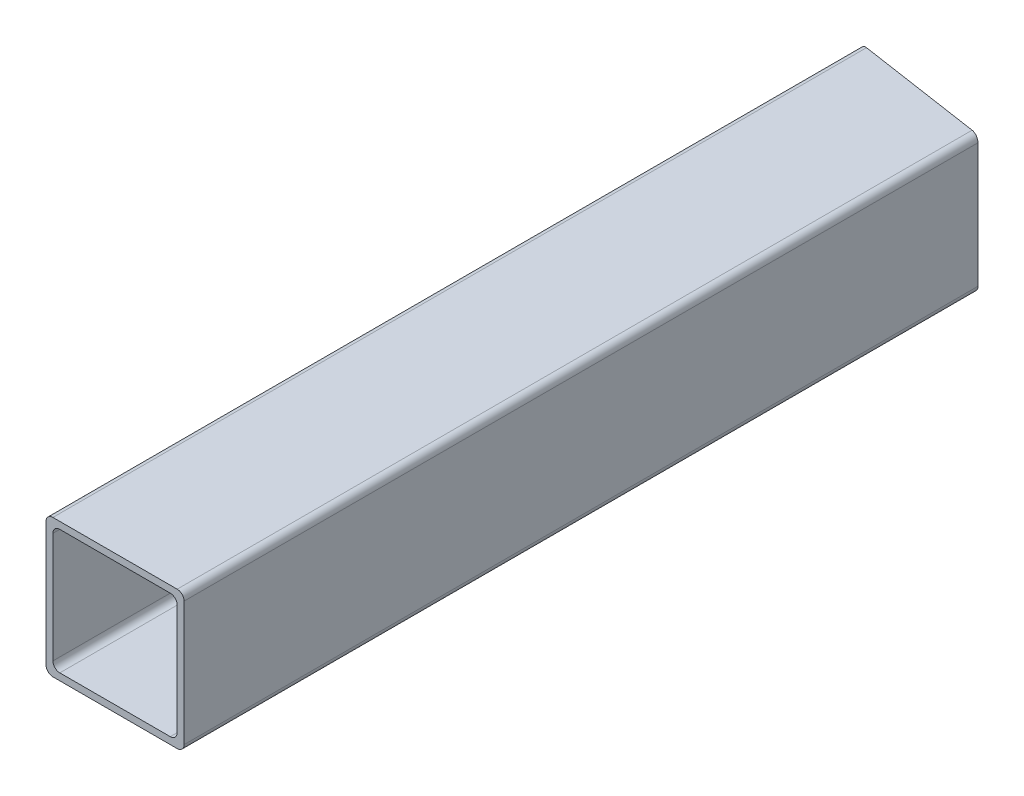
ISO-10303-21;
HEADER;
FILE_DESCRIPTION(('STEP AP214'),'2;1');
FILE_NAME('part.step','',(''),(''),'','','');
FILE_SCHEMA(('AUTOMOTIVE_DESIGN { 1 0 10303 214 1 1 1 1 }'));
ENDSEC;
DATA;
#1=APPLICATION_CONTEXT('core data for automotive mechanical design processes');
#2=APPLICATION_PROTOCOL_DEFINITION('international standard','automotive_design',2000,#1);
#3=PRODUCT_CONTEXT('',#1,'mechanical');
#4=PRODUCT('Part','Part','',(#3));
#5=PRODUCT_RELATED_PRODUCT_CATEGORY('part','',(#4));
#6=PRODUCT_DEFINITION_FORMATION('','',#4);
#7=PRODUCT_DEFINITION_CONTEXT('part definition',#1,'design');
#8=PRODUCT_DEFINITION('design','',#6,#7);
#9=PRODUCT_DEFINITION_SHAPE('','',#8);
#10=(LENGTH_UNIT() NAMED_UNIT(*) SI_UNIT(.MILLI.,.METRE.));
#11=(NAMED_UNIT(*) PLANE_ANGLE_UNIT() SI_UNIT($,.RADIAN.));
#12=(NAMED_UNIT(*) SI_UNIT($,.STERADIAN.) SOLID_ANGLE_UNIT());
#13=UNCERTAINTY_MEASURE_WITH_UNIT(LENGTH_MEASURE(1.E-05),#10,'distance_accuracy_value','');
#14=(GEOMETRIC_REPRESENTATION_CONTEXT(3) GLOBAL_UNCERTAINTY_ASSIGNED_CONTEXT((#13)) GLOBAL_UNIT_ASSIGNED_CONTEXT((#10,
#11,#12)) REPRESENTATION_CONTEXT('',''));
#15=CARTESIAN_POINT('',(0.,0.,0.));
#16=DIRECTION('',(0.,0.,1.));
#17=DIRECTION('',(1.,0.,0.));
#18=AXIS2_PLACEMENT_3D('',#15,#16,#17);
#19=CARTESIAN_POINT('',(18.,18.,236.));
#20=DIRECTION('',(0.,0.,-1.));
#21=DIRECTION('',(-1.,0.,0.));
#22=AXIS2_PLACEMENT_3D('',#19,#20,#21);
#23=PLANE('',#22);
#24=CARTESIAN_POINT('',(18.,18.,236.));
#25=DIRECTION('',(0.,0.,1.));
#26=DIRECTION('',(-1.,0.,0.));
#27=AXIS2_PLACEMENT_3D('',#24,#25,#26);
#28=CIRCLE('',#27,2.);
#29=CARTESIAN_POINT('',(20.,18.,236.));
#30=VERTEX_POINT('',#29);
#31=CARTESIAN_POINT('',(18.,20.,236.));
#32=VERTEX_POINT('',#31);
#33=EDGE_CURVE('E189',#30,#32,#28,.T.);
#34=ORIENTED_EDGE('',*,*,#33,.T.);
#35=DIRECTION('',(-1.,0.,0.));
#36=VECTOR('',#35,1.);
#37=CARTESIAN_POINT('',(-18.,20.,236.));
#38=LINE('',#37,#36);
#39=CARTESIAN_POINT('',(-18.,20.,236.));
#40=VERTEX_POINT('',#39);
#41=EDGE_CURVE('E201',#32,#40,#38,.T.);
#42=ORIENTED_EDGE('',*,*,#41,.T.);
#43=CARTESIAN_POINT('',(-18.,18.,236.));
#44=DIRECTION('',(0.,0.,1.));
#45=DIRECTION('',(1.,0.,0.));
#46=AXIS2_PLACEMENT_3D('',#43,#44,#45);
#47=CIRCLE('',#46,2.);
#48=CARTESIAN_POINT('',(-20.,18.,236.));
#49=VERTEX_POINT('',#48);
#50=EDGE_CURVE('E167',#40,#49,#47,.T.);
#51=ORIENTED_EDGE('',*,*,#50,.T.);
#52=DIRECTION('',(0.,-1.,0.));
#53=VECTOR('',#52,1.);
#54=CARTESIAN_POINT('',(-20.,18.,236.));
#55=LINE('',#54,#53);
#56=CARTESIAN_POINT('',(-20.,-18.,236.));
#57=VERTEX_POINT('',#56);
#58=EDGE_CURVE('E198',#49,#57,#55,.T.);
#59=ORIENTED_EDGE('',*,*,#58,.T.);
#60=CARTESIAN_POINT('',(-18.,-18.,236.));
#61=DIRECTION('',(0.,0.,1.));
#62=DIRECTION('',(1.,0.,0.));
#63=AXIS2_PLACEMENT_3D('',#60,#61,#62);
#64=CIRCLE('',#63,2.);
#65=CARTESIAN_POINT('',(-18.,-20.,236.));
#66=VERTEX_POINT('',#65);
#67=EDGE_CURVE('E196',#57,#66,#64,.T.);
#68=ORIENTED_EDGE('',*,*,#67,.T.);
#69=DIRECTION('',(1.,0.,0.));
#70=VECTOR('',#69,1.);
#71=CARTESIAN_POINT('',(-18.,-20.,236.));
#72=LINE('',#71,#70);
#73=CARTESIAN_POINT('',(18.,-20.,236.));
#74=VERTEX_POINT('',#73);
#75=EDGE_CURVE('E194',#66,#74,#72,.T.);
#76=ORIENTED_EDGE('',*,*,#75,.T.);
#77=CARTESIAN_POINT('',(18.,-18.,236.));
#78=DIRECTION('',(0.,0.,1.));
#79=DIRECTION('',(1.,0.,0.));
#80=AXIS2_PLACEMENT_3D('',#77,#78,#79);
#81=CIRCLE('',#80,2.);
#82=CARTESIAN_POINT('',(20.,-18.,236.));
#83=VERTEX_POINT('',#82);
#84=EDGE_CURVE('E192',#74,#83,#81,.T.);
#85=ORIENTED_EDGE('',*,*,#84,.T.);
#86=DIRECTION('',(0.,1.,0.));
#87=VECTOR('',#86,1.);
#88=CARTESIAN_POINT('',(20.,18.,236.));
#89=LINE('',#88,#87);
#90=EDGE_CURVE('E187',#83,#30,#89,.T.);
#91=ORIENTED_EDGE('',*,*,#90,.T.);
#92=EDGE_LOOP('',(#34,#42,#51,#59,#68,#76,#85,#91));
#93=FACE_BOUND('',#92,.T.);
#94=CARTESIAN_POINT('',(16.,16.,236.));
#95=DIRECTION('',(0.,0.,1.));
#96=DIRECTION('',(-1.,0.,0.));
#97=AXIS2_PLACEMENT_3D('',#94,#95,#96);
#98=CIRCLE('',#97,2.);
#99=CARTESIAN_POINT('',(18.,16.,236.));
#100=VERTEX_POINT('',#99);
#101=CARTESIAN_POINT('',(16.,18.,236.));
#102=VERTEX_POINT('',#101);
#103=EDGE_CURVE('E243',#100,#102,#98,.T.);
#104=ORIENTED_EDGE('',*,*,#103,.F.);
#105=DIRECTION('',(0.,1.,0.));
#106=VECTOR('',#105,1.);
#107=CARTESIAN_POINT('',(18.,16.,236.));
#108=LINE('',#107,#106);
#109=CARTESIAN_POINT('',(18.,-16.,236.));
#110=VERTEX_POINT('',#109);
#111=EDGE_CURVE('E228',#110,#100,#108,.T.);
#112=ORIENTED_EDGE('',*,*,#111,.F.);
#113=CARTESIAN_POINT('',(16.,-16.,236.));
#114=DIRECTION('',(0.,0.,1.));
#115=DIRECTION('',(1.,0.,0.));
#116=AXIS2_PLACEMENT_3D('',#113,#114,#115);
#117=CIRCLE('',#116,2.);
#118=CARTESIAN_POINT('',(16.,-18.,236.));
#119=VERTEX_POINT('',#118);
#120=EDGE_CURVE('E230',#119,#110,#117,.T.);
#121=ORIENTED_EDGE('',*,*,#120,.F.);
#122=DIRECTION('',(1.,0.,0.));
#123=VECTOR('',#122,1.);
#124=CARTESIAN_POINT('',(-16.,-18.,236.));
#125=LINE('',#124,#123);
#126=CARTESIAN_POINT('',(-16.,-18.,236.));
#127=VERTEX_POINT('',#126);
#128=EDGE_CURVE('E233',#127,#119,#125,.T.);
#129=ORIENTED_EDGE('',*,*,#128,.F.);
#130=CARTESIAN_POINT('',(-16.,-16.,236.));
#131=DIRECTION('',(0.,0.,1.));
#132=DIRECTION('',(1.,0.,0.));
#133=AXIS2_PLACEMENT_3D('',#130,#131,#132);
#134=CIRCLE('',#133,2.);
#135=CARTESIAN_POINT('',(-18.,-16.,236.));
#136=VERTEX_POINT('',#135);
#137=EDGE_CURVE('E235',#136,#127,#134,.T.);
#138=ORIENTED_EDGE('',*,*,#137,.F.);
#139=DIRECTION('',(0.,-1.,0.));
#140=VECTOR('',#139,1.);
#141=CARTESIAN_POINT('',(-18.,16.,236.));
#142=LINE('',#141,#140);
#143=CARTESIAN_POINT('',(-18.,16.,236.));
#144=VERTEX_POINT('',#143);
#145=EDGE_CURVE('E237',#144,#136,#142,.T.);
#146=ORIENTED_EDGE('',*,*,#145,.F.);
#147=CARTESIAN_POINT('',(-16.,16.,236.));
#148=DIRECTION('',(0.,0.,1.));
#149=DIRECTION('',(1.,0.,0.));
#150=AXIS2_PLACEMENT_3D('',#147,#148,#149);
#151=CIRCLE('',#150,2.);
#152=CARTESIAN_POINT('',(-16.,18.,236.));
#153=VERTEX_POINT('',#152);
#154=EDGE_CURVE('E239',#153,#144,#151,.T.);
#155=ORIENTED_EDGE('',*,*,#154,.F.);
#156=DIRECTION('',(-1.,0.,0.));
#157=VECTOR('',#156,1.);
#158=CARTESIAN_POINT('',(-16.,18.,236.));
#159=LINE('',#158,#157);
#160=EDGE_CURVE('E241',#102,#153,#159,.T.);
#161=ORIENTED_EDGE('',*,*,#160,.F.);
#162=EDGE_LOOP('',(#104,#112,#121,#129,#138,#146,#155,#161));
#163=FACE_BOUND('',#162,.T.);
#164=ADVANCED_FACE('F35',(#93,#163),#23,.F.);
#165=CARTESIAN_POINT('',(18.,18.,236.));
#166=DIRECTION('',(0.,0.,-1.));
#167=DIRECTION('',(-1.,0.,0.));
#168=AXIS2_PLACEMENT_3D('',#165,#166,#167);
#169=CYLINDRICAL_SURFACE('',#168,2.);
#170=DIRECTION('',(0.,0.,-1.));
#171=VECTOR('',#170,1.);
#172=CARTESIAN_POINT('',(20.,18.,236.));
#173=LINE('',#172,#171);
#174=CARTESIAN_POINT('',(20.,18.,6.00000000000001));
#175=VERTEX_POINT('',#174);
#176=EDGE_CURVE('E184',#30,#175,#173,.T.);
#177=ORIENTED_EDGE('',*,*,#176,.T.);
#178=CARTESIAN_POINT('',(18.,18.,5.70000000000001));
#179=DIRECTION('',(-0.148340452930245,0.,0.988936352868298));
#180=DIRECTION('',(-0.988936352868298,0.,-0.148340452930245));
#181=AXIS2_PLACEMENT_3D('',#178,#179,#180);
#182=ELLIPSE('',#181,2.02237484161567,2.);
#183=CARTESIAN_POINT('',(18.,20.,5.7));
#184=VERTEX_POINT('',#183);
#185=EDGE_CURVE('E50',#175,#184,#182,.T.);
#186=ORIENTED_EDGE('',*,*,#185,.T.);
#187=DIRECTION('',(0.,0.,-1.));
#188=VECTOR('',#187,1.);
#189=CARTESIAN_POINT('',(18.,20.,236.));
#190=LINE('',#189,#188);
#191=EDGE_CURVE('E43',#32,#184,#190,.T.);
#192=ORIENTED_EDGE('',*,*,#191,.F.);
#193=ORIENTED_EDGE('',*,*,#33,.F.);
#194=EDGE_LOOP('',(#177,#186,#192,#193));
#195=FACE_BOUND('',#194,.T.);
#196=ADVANCED_FACE('F37',(#195),#169,.T.);
#197=CARTESIAN_POINT('',(-18.,20.,236.));
#198=DIRECTION('',(0.,-1.,0.));
#199=DIRECTION('',(0.,0.,-1.));
#200=AXIS2_PLACEMENT_3D('',#197,#198,#199);
#201=PLANE('',#200);
#202=ORIENTED_EDGE('',*,*,#191,.T.);
#203=DIRECTION('',(0.988936352868298,0.,0.148340452930245));
#204=VECTOR('',#203,1.);
#205=CARTESIAN_POINT('',(20.,20.,6.));
#206=LINE('',#205,#204);
#207=CARTESIAN_POINT('',(-18.,20.,0.299999999999998));
#208=VERTEX_POINT('',#207);
#209=EDGE_CURVE('E148',#208,#184,#206,.T.);
#210=ORIENTED_EDGE('',*,*,#209,.F.);
#211=DIRECTION('',(0.,0.,-1.));
#212=VECTOR('',#211,1.);
#213=CARTESIAN_POINT('',(-18.,20.,236.));
#214=LINE('',#213,#212);
#215=EDGE_CURVE('E161',#40,#208,#214,.T.);
#216=ORIENTED_EDGE('',*,*,#215,.F.);
#217=ORIENTED_EDGE('',*,*,#41,.F.);
#218=EDGE_LOOP('',(#202,#210,#216,#217));
#219=FACE_BOUND('',#218,.T.);
#220=ADVANCED_FACE('F160',(#219),#201,.F.);
#221=CARTESIAN_POINT('',(-18.,18.,236.));
#222=DIRECTION('',(0.,0.,-1.));
#223=DIRECTION('',(-1.,0.,0.));
#224=AXIS2_PLACEMENT_3D('',#221,#222,#223);
#225=CYLINDRICAL_SURFACE('',#224,2.);
#226=ORIENTED_EDGE('',*,*,#215,.T.);
#227=CARTESIAN_POINT('',(-18.,18.,0.299999999999995));
#228=DIRECTION('',(-0.148340452930245,0.,0.988936352868298));
#229=DIRECTION('',(-0.988936352868298,0.,-0.148340452930245));
#230=AXIS2_PLACEMENT_3D('',#227,#228,#229);
#231=ELLIPSE('',#230,2.02237484161567,2.);
#232=CARTESIAN_POINT('',(-20.,18.,0.));
#233=VERTEX_POINT('',#232);
#234=EDGE_CURVE('E145',#208,#233,#231,.T.);
#235=ORIENTED_EDGE('',*,*,#234,.T.);
#236=DIRECTION('',(0.,0.,-1.));
#237=VECTOR('',#236,1.);
#238=CARTESIAN_POINT('',(-20.,18.,236.));
#239=LINE('',#238,#237);
#240=EDGE_CURVE('E168',#49,#233,#239,.T.);
#241=ORIENTED_EDGE('',*,*,#240,.F.);
#242=ORIENTED_EDGE('',*,*,#50,.F.);
#243=EDGE_LOOP('',(#226,#235,#241,#242));
#244=FACE_BOUND('',#243,.T.);
#245=ADVANCED_FACE('F166',(#244),#225,.T.);
#246=CARTESIAN_POINT('',(-20.,18.,236.));
#247=DIRECTION('',(1.,0.,0.));
#248=DIRECTION('',(0.,0.,-1.));
#249=AXIS2_PLACEMENT_3D('',#246,#247,#248);
#250=PLANE('',#249);
#251=DIRECTION('',(0.,-1.,0.));
#252=VECTOR('',#251,1.);
#253=CARTESIAN_POINT('',(-20.,18.,0.));
#254=LINE('',#253,#252);
#255=CARTESIAN_POINT('',(-20.,-18.,0.));
#256=VERTEX_POINT('',#255);
#257=EDGE_CURVE('E150',#233,#256,#254,.T.);
#258=ORIENTED_EDGE('',*,*,#257,.T.);
#259=DIRECTION('',(0.,0.,-1.));
#260=VECTOR('',#259,1.);
#261=CARTESIAN_POINT('',(-20.,-18.,236.));
#262=LINE('',#261,#260);
#263=EDGE_CURVE('E170',#57,#256,#262,.T.);
#264=ORIENTED_EDGE('',*,*,#263,.F.);
#265=ORIENTED_EDGE('',*,*,#58,.F.);
#266=ORIENTED_EDGE('',*,*,#240,.T.);
#267=EDGE_LOOP('',(#258,#264,#265,#266));
#268=FACE_BOUND('',#267,.T.);
#269=ADVANCED_FACE('F286',(#268),#250,.F.);
#270=CARTESIAN_POINT('',(-18.,-18.,236.));
#271=DIRECTION('',(0.,0.,-1.));
#272=DIRECTION('',(-1.,0.,0.));
#273=AXIS2_PLACEMENT_3D('',#270,#271,#272);
#274=CYLINDRICAL_SURFACE('',#273,2.);
#275=ORIENTED_EDGE('',*,*,#263,.T.);
#276=CARTESIAN_POINT('',(-18.,-18.,0.299999999999995));
#277=DIRECTION('',(-0.148340452930245,0.,0.988936352868298));
#278=DIRECTION('',(-0.988936352868298,0.,-0.148340452930245));
#279=AXIS2_PLACEMENT_3D('',#276,#277,#278);
#280=ELLIPSE('',#279,2.02237484161567,2.);
#281=CARTESIAN_POINT('',(-18.,-20.,0.300000000000003));
#282=VERTEX_POINT('',#281);
#283=EDGE_CURVE('E155',#256,#282,#280,.T.);
#284=ORIENTED_EDGE('',*,*,#283,.T.);
#285=DIRECTION('',(0.,0.,-1.));
#286=VECTOR('',#285,1.);
#287=CARTESIAN_POINT('',(-18.,-20.,236.));
#288=LINE('',#287,#286);
#289=EDGE_CURVE('E175',#66,#282,#288,.T.);
#290=ORIENTED_EDGE('',*,*,#289,.F.);
#291=ORIENTED_EDGE('',*,*,#67,.F.);
#292=EDGE_LOOP('',(#275,#284,#290,#291));
#293=FACE_BOUND('',#292,.T.);
#294=ADVANCED_FACE('F284',(#293),#274,.T.);
#295=CARTESIAN_POINT('',(-18.,-20.,236.));
#296=DIRECTION('',(0.,1.,0.));
#297=DIRECTION('',(0.,0.,1.));
#298=AXIS2_PLACEMENT_3D('',#295,#296,#297);
#299=PLANE('',#298);
#300=ORIENTED_EDGE('',*,*,#289,.T.);
#301=DIRECTION('',(0.988936352868298,0.,0.148340452930245));
#302=VECTOR('',#301,1.);
#303=CARTESIAN_POINT('',(20.,-20.,6.));
#304=LINE('',#303,#302);
#305=CARTESIAN_POINT('',(18.,-20.,5.70000000000001));
#306=VERTEX_POINT('',#305);
#307=EDGE_CURVE('E164',#282,#306,#304,.T.);
#308=ORIENTED_EDGE('',*,*,#307,.T.);
#309=DIRECTION('',(0.,0.,-1.));
#310=VECTOR('',#309,1.);
#311=CARTESIAN_POINT('',(18.,-20.,236.));
#312=LINE('',#311,#310);
#313=EDGE_CURVE('E178',#74,#306,#312,.T.);
#314=ORIENTED_EDGE('',*,*,#313,.F.);
#315=ORIENTED_EDGE('',*,*,#75,.F.);
#316=EDGE_LOOP('',(#300,#308,#314,#315));
#317=FACE_BOUND('',#316,.T.);
#318=ADVANCED_FACE('F269',(#317),#299,.F.);
#319=CARTESIAN_POINT('',(18.,-18.,236.));
#320=DIRECTION('',(0.,0.,-1.));
#321=DIRECTION('',(-1.,0.,0.));
#322=AXIS2_PLACEMENT_3D('',#319,#320,#321);
#323=CYLINDRICAL_SURFACE('',#322,2.);
#324=ORIENTED_EDGE('',*,*,#313,.T.);
#325=CARTESIAN_POINT('',(18.,-18.,5.70000000000001));
#326=DIRECTION('',(-0.148340452930245,0.,0.988936352868298));
#327=DIRECTION('',(-0.988936352868298,0.,-0.148340452930245));
#328=AXIS2_PLACEMENT_3D('',#325,#326,#327);
#329=ELLIPSE('',#328,2.02237484161567,2.);
#330=CARTESIAN_POINT('',(20.,-18.,6.));
#331=VERTEX_POINT('',#330);
#332=EDGE_CURVE('E248',#306,#331,#329,.T.);
#333=ORIENTED_EDGE('',*,*,#332,.T.);
#334=DIRECTION('',(0.,0.,-1.));
#335=VECTOR('',#334,1.);
#336=CARTESIAN_POINT('',(20.,-18.,236.));
#337=LINE('',#336,#335);
#338=EDGE_CURVE('E181',#83,#331,#337,.T.);
#339=ORIENTED_EDGE('',*,*,#338,.F.);
#340=ORIENTED_EDGE('',*,*,#84,.F.);
#341=EDGE_LOOP('',(#324,#333,#339,#340));
#342=FACE_BOUND('',#341,.T.);
#343=ADVANCED_FACE('F274',(#342),#323,.T.);
#344=CARTESIAN_POINT('',(20.,18.,236.));
#345=DIRECTION('',(-1.,0.,0.));
#346=DIRECTION('',(0.,-1.,0.));
#347=AXIS2_PLACEMENT_3D('',#344,#345,#346);
#348=PLANE('',#347);
#349=ORIENTED_EDGE('',*,*,#338,.T.);
#350=DIRECTION('',(0.,1.,0.));
#351=VECTOR('',#350,1.);
#352=CARTESIAN_POINT('',(20.,-20.,6.));
#353=LINE('',#352,#351);
#354=EDGE_CURVE('E264',#331,#175,#353,.T.);
#355=ORIENTED_EDGE('',*,*,#354,.T.);
#356=ORIENTED_EDGE('',*,*,#176,.F.);
#357=ORIENTED_EDGE('',*,*,#90,.F.);
#358=EDGE_LOOP('',(#349,#355,#356,#357));
#359=FACE_BOUND('',#358,.T.);
#360=ADVANCED_FACE('F305',(#359),#348,.F.);
#361=CARTESIAN_POINT('',(16.,16.,236.));
#362=DIRECTION('',(0.,0.,-1.));
#363=DIRECTION('',(-1.,0.,0.));
#364=AXIS2_PLACEMENT_3D('',#361,#362,#363);
#365=CYLINDRICAL_SURFACE('',#364,2.);
#366=CARTESIAN_POINT('',(16.,16.,5.39999999999999));
#367=DIRECTION('',(-0.148340452930245,0.,0.988936352868298));
#368=DIRECTION('',(-0.988936352868298,0.,-0.148340452930245));
#369=AXIS2_PLACEMENT_3D('',#366,#367,#368);
#370=ELLIPSE('',#369,2.02237484161567,2.);
#371=CARTESIAN_POINT('',(18.,16.,5.70000000000001));
#372=VERTEX_POINT('',#371);
#373=CARTESIAN_POINT('',(16.,18.,5.40000000000001));
#374=VERTEX_POINT('',#373);
#375=EDGE_CURVE('E251',#372,#374,#370,.T.);
#376=ORIENTED_EDGE('',*,*,#375,.F.);
#377=DIRECTION('',(0.,0.,-1.));
#378=VECTOR('',#377,1.);
#379=CARTESIAN_POINT('',(18.,16.,236.));
#380=LINE('',#379,#378);
#381=EDGE_CURVE('E225',#100,#372,#380,.T.);
#382=ORIENTED_EDGE('',*,*,#381,.F.);
#383=ORIENTED_EDGE('',*,*,#103,.T.);
#384=DIRECTION('',(0.,0.,-1.));
#385=VECTOR('',#384,1.);
#386=CARTESIAN_POINT('',(16.,18.,236.));
#387=LINE('',#386,#385);
#388=EDGE_CURVE('E190',#102,#374,#387,.T.);
#389=ORIENTED_EDGE('',*,*,#388,.T.);
#390=EDGE_LOOP('',(#376,#382,#383,#389));
#391=FACE_BOUND('',#390,.T.);
#392=ADVANCED_FACE('F303',(#391),#365,.F.);
#393=CARTESIAN_POINT('',(-16.,18.,236.));
#394=DIRECTION('',(0.,-1.,0.));
#395=DIRECTION('',(0.,0.,-1.));
#396=AXIS2_PLACEMENT_3D('',#393,#394,#395);
#397=PLANE('',#396);
#398=DIRECTION('',(-0.988936352868298,0.,-0.148340452930245));
#399=VECTOR('',#398,1.);
#400=CARTESIAN_POINT('',(18.5330073349634,18.,5.77995110024451));
#401=LINE('',#400,#399);
#402=CARTESIAN_POINT('',(-16.,18.,0.599999999999989));
#403=VERTEX_POINT('',#402);
#404=EDGE_CURVE('E253',#374,#403,#401,.T.);
#405=ORIENTED_EDGE('',*,*,#404,.F.);
#406=ORIENTED_EDGE('',*,*,#388,.F.);
#407=ORIENTED_EDGE('',*,*,#160,.T.);
#408=DIRECTION('',(0.,0.,-1.));
#409=VECTOR('',#408,1.);
#410=CARTESIAN_POINT('',(-16.,18.,236.));
#411=LINE('',#410,#409);
#412=EDGE_CURVE('E207',#153,#403,#411,.T.);
#413=ORIENTED_EDGE('',*,*,#412,.T.);
#414=EDGE_LOOP('',(#405,#406,#407,#413));
#415=FACE_BOUND('',#414,.T.);
#416=ADVANCED_FACE('F330',(#415),#397,.T.);
#417=CARTESIAN_POINT('',(-16.,16.,236.));
#418=DIRECTION('',(0.,0.,-1.));
#419=DIRECTION('',(-1.,0.,0.));
#420=AXIS2_PLACEMENT_3D('',#417,#418,#419);
#421=CYLINDRICAL_SURFACE('',#420,2.);
#422=CARTESIAN_POINT('',(-16.,16.,0.599999999999989));
#423=DIRECTION('',(-0.148340452930245,0.,0.988936352868298));
#424=DIRECTION('',(-0.988936352868298,0.,-0.148340452930245));
#425=AXIS2_PLACEMENT_3D('',#422,#423,#424);
#426=ELLIPSE('',#425,2.02237484161567,2.);
#427=CARTESIAN_POINT('',(-18.,16.,0.299999999999995));
#428=VERTEX_POINT('',#427);
#429=EDGE_CURVE('E255',#403,#428,#426,.T.);
#430=ORIENTED_EDGE('',*,*,#429,.F.);
#431=ORIENTED_EDGE('',*,*,#412,.F.);
#432=ORIENTED_EDGE('',*,*,#154,.T.);
#433=DIRECTION('',(0.,0.,-1.));
#434=VECTOR('',#433,1.);
#435=CARTESIAN_POINT('',(-18.,16.,236.));
#436=LINE('',#435,#434);
#437=EDGE_CURVE('E210',#144,#428,#436,.T.);
#438=ORIENTED_EDGE('',*,*,#437,.T.);
#439=EDGE_LOOP('',(#430,#431,#432,#438));
#440=FACE_BOUND('',#439,.T.);
#441=ADVANCED_FACE('F337',(#440),#421,.F.);
#442=CARTESIAN_POINT('',(-18.,16.,236.));
#443=DIRECTION('',(1.,0.,0.));
#444=DIRECTION('',(0.,1.,0.));
#445=AXIS2_PLACEMENT_3D('',#442,#443,#444);
#446=PLANE('',#445);
#447=DIRECTION('',(0.,-1.,0.));
#448=VECTOR('',#447,1.);
#449=CARTESIAN_POINT('',(-18.,16.,0.299999999999995));
#450=LINE('',#449,#448);
#451=CARTESIAN_POINT('',(-18.,-16.,0.299999999999995));
#452=VERTEX_POINT('',#451);
#453=EDGE_CURVE('E257',#428,#452,#450,.T.);
#454=ORIENTED_EDGE('',*,*,#453,.F.);
#455=ORIENTED_EDGE('',*,*,#437,.F.);
#456=ORIENTED_EDGE('',*,*,#145,.T.);
#457=DIRECTION('',(0.,0.,-1.));
#458=VECTOR('',#457,1.);
#459=CARTESIAN_POINT('',(-18.,-16.,236.));
#460=LINE('',#459,#458);
#461=EDGE_CURVE('E213',#136,#452,#460,.T.);
#462=ORIENTED_EDGE('',*,*,#461,.T.);
#463=EDGE_LOOP('',(#454,#455,#456,#462));
#464=FACE_BOUND('',#463,.T.);
#465=ADVANCED_FACE('F344',(#464),#446,.T.);
#466=CARTESIAN_POINT('',(-16.,-16.,236.));
#467=DIRECTION('',(0.,0.,-1.));
#468=DIRECTION('',(-1.,0.,0.));
#469=AXIS2_PLACEMENT_3D('',#466,#467,#468);
#470=CYLINDRICAL_SURFACE('',#469,2.);
#471=CARTESIAN_POINT('',(-16.,-16.,0.599999999999989));
#472=DIRECTION('',(-0.148340452930245,0.,0.988936352868298));
#473=DIRECTION('',(-0.988936352868298,0.,-0.148340452930245));
#474=AXIS2_PLACEMENT_3D('',#471,#472,#473);
#475=ELLIPSE('',#474,2.02237484161567,2.);
#476=CARTESIAN_POINT('',(-16.,-18.,0.600000000000011));
#477=VERTEX_POINT('',#476);
#478=EDGE_CURVE('E259',#452,#477,#475,.T.);
#479=ORIENTED_EDGE('',*,*,#478,.F.);
#480=ORIENTED_EDGE('',*,*,#461,.F.);
#481=ORIENTED_EDGE('',*,*,#137,.T.);
#482=DIRECTION('',(0.,0.,-1.));
#483=VECTOR('',#482,1.);
#484=CARTESIAN_POINT('',(-16.,-18.,236.));
#485=LINE('',#484,#483);
#486=EDGE_CURVE('E216',#127,#477,#485,.T.);
#487=ORIENTED_EDGE('',*,*,#486,.T.);
#488=EDGE_LOOP('',(#479,#480,#481,#487));
#489=FACE_BOUND('',#488,.T.);
#490=ADVANCED_FACE('F352',(#489),#470,.F.);
#491=CARTESIAN_POINT('',(-16.,-18.,236.));
#492=DIRECTION('',(0.,1.,0.));
#493=DIRECTION('',(0.,0.,1.));
#494=AXIS2_PLACEMENT_3D('',#491,#492,#493);
#495=PLANE('',#494);
#496=DIRECTION('',(0.988936352868298,0.,0.148340452930245));
#497=VECTOR('',#496,1.);
#498=CARTESIAN_POINT('',(18.5330073349634,-18.,5.77995110024451));
#499=LINE('',#498,#497);
#500=CARTESIAN_POINT('',(16.,-18.,5.39999999999999));
#501=VERTEX_POINT('',#500);
#502=EDGE_CURVE('E261',#477,#501,#499,.T.);
#503=ORIENTED_EDGE('',*,*,#502,.F.);
#504=ORIENTED_EDGE('',*,*,#486,.F.);
#505=ORIENTED_EDGE('',*,*,#128,.T.);
#506=DIRECTION('',(0.,0.,-1.));
#507=VECTOR('',#506,1.);
#508=CARTESIAN_POINT('',(16.,-18.,236.));
#509=LINE('',#508,#507);
#510=EDGE_CURVE('E219',#119,#501,#509,.T.);
#511=ORIENTED_EDGE('',*,*,#510,.T.);
#512=EDGE_LOOP('',(#503,#504,#505,#511));
#513=FACE_BOUND('',#512,.T.);
#514=ADVANCED_FACE('F360',(#513),#495,.T.);
#515=CARTESIAN_POINT('',(16.,-16.,236.));
#516=DIRECTION('',(0.,0.,-1.));
#517=DIRECTION('',(-1.,0.,0.));
#518=AXIS2_PLACEMENT_3D('',#515,#516,#517);
#519=CYLINDRICAL_SURFACE('',#518,2.);
#520=CARTESIAN_POINT('',(16.,-16.,5.39999999999999));
#521=DIRECTION('',(-0.148340452930245,0.,0.988936352868298));
#522=DIRECTION('',(-0.988936352868298,0.,-0.148340452930245));
#523=AXIS2_PLACEMENT_3D('',#520,#521,#522);
#524=ELLIPSE('',#523,2.02237484161567,2.);
#525=CARTESIAN_POINT('',(18.,-16.,5.70000000000001));
#526=VERTEX_POINT('',#525);
#527=EDGE_CURVE('E57',#501,#526,#524,.T.);
#528=ORIENTED_EDGE('',*,*,#527,.F.);
#529=ORIENTED_EDGE('',*,*,#510,.F.);
#530=ORIENTED_EDGE('',*,*,#120,.T.);
#531=DIRECTION('',(0.,0.,-1.));
#532=VECTOR('',#531,1.);
#533=CARTESIAN_POINT('',(18.,-16.,236.));
#534=LINE('',#533,#532);
#535=EDGE_CURVE('E222',#110,#526,#534,.T.);
#536=ORIENTED_EDGE('',*,*,#535,.T.);
#537=EDGE_LOOP('',(#528,#529,#530,#536));
#538=FACE_BOUND('',#537,.T.);
#539=ADVANCED_FACE('F368',(#538),#519,.F.);
#540=CARTESIAN_POINT('',(18.,16.,236.));
#541=DIRECTION('',(-1.,0.,0.));
#542=DIRECTION('',(0.,0.,1.));
#543=AXIS2_PLACEMENT_3D('',#540,#541,#542);
#544=PLANE('',#543);
#545=DIRECTION('',(0.,1.,0.));
#546=VECTOR('',#545,1.);
#547=CARTESIAN_POINT('',(18.,16.,5.70000000000001));
#548=LINE('',#547,#546);
#549=EDGE_CURVE('E11',#526,#372,#548,.T.);
#550=ORIENTED_EDGE('',*,*,#549,.F.);
#551=ORIENTED_EDGE('',*,*,#535,.F.);
#552=ORIENTED_EDGE('',*,*,#111,.T.);
#553=ORIENTED_EDGE('',*,*,#381,.T.);
#554=EDGE_LOOP('',(#550,#551,#552,#553));
#555=FACE_BOUND('',#554,.T.);
#556=ADVANCED_FACE('F376',(#555),#544,.T.);
#557=CARTESIAN_POINT('',(20.,-20.,6.));
#558=DIRECTION('',(-0.148340452930245,0.,0.988936352868298));
#559=DIRECTION('',(0.988936352868298,0.,0.148340452930245));
#560=AXIS2_PLACEMENT_3D('',#557,#558,#559);
#561=PLANE('',#560);
#562=ORIENTED_EDGE('',*,*,#375,.T.);
#563=ORIENTED_EDGE('',*,*,#404,.T.);
#564=ORIENTED_EDGE('',*,*,#429,.T.);
#565=ORIENTED_EDGE('',*,*,#453,.T.);
#566=ORIENTED_EDGE('',*,*,#478,.T.);
#567=ORIENTED_EDGE('',*,*,#502,.T.);
#568=ORIENTED_EDGE('',*,*,#527,.T.);
#569=ORIENTED_EDGE('',*,*,#549,.T.);
#570=EDGE_LOOP('',(#562,#563,#564,#565,#566,#567,#568,#569));
#571=FACE_BOUND('',#570,.T.);
#572=ORIENTED_EDGE('',*,*,#354,.F.);
#573=ORIENTED_EDGE('',*,*,#332,.F.);
#574=ORIENTED_EDGE('',*,*,#307,.F.);
#575=ORIENTED_EDGE('',*,*,#283,.F.);
#576=ORIENTED_EDGE('',*,*,#257,.F.);
#577=ORIENTED_EDGE('',*,*,#234,.F.);
#578=ORIENTED_EDGE('',*,*,#209,.T.);
#579=ORIENTED_EDGE('',*,*,#185,.F.);
#580=EDGE_LOOP('',(#572,#573,#574,#575,#576,#577,#578,#579));
#581=FACE_BOUND('',#580,.T.);
#582=ADVANCED_FACE('F147',(#571,#581),#561,.F.);
#583=CLOSED_SHELL('',(#164,#196,#220,#245,#269,#294,#318,#343,#360,#392,#416,#441,#465,#490,
#514,#539,#556,#582));
#584=MANIFOLD_SOLID_BREP('B2',#583);
#585=ADVANCED_BREP_SHAPE_REPRESENTATION('',(#18,#584),#14);
#586=SHAPE_DEFINITION_REPRESENTATION(#9,#585);
ENDSEC;
END-ISO-10303-21;
